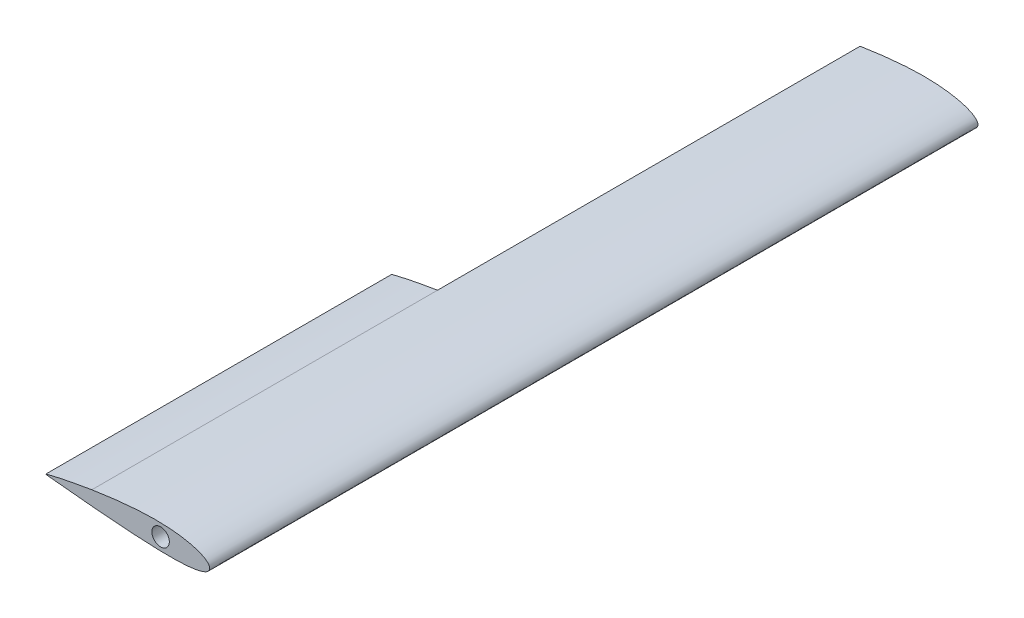
ISO-10303-21;
HEADER;
FILE_DESCRIPTION(('STEP AP214'),'2;1');
FILE_NAME('part.step','',(''),(''),'','','');
FILE_SCHEMA(('AUTOMOTIVE_DESIGN { 1 0 10303 214 1 1 1 1 }'));
ENDSEC;
DATA;
#1=APPLICATION_CONTEXT('core data for automotive mechanical design processes');
#2=APPLICATION_PROTOCOL_DEFINITION('international standard','automotive_design',2000,#1);
#3=PRODUCT_CONTEXT('',#1,'mechanical');
#4=PRODUCT('Part','Part','',(#3));
#5=PRODUCT_RELATED_PRODUCT_CATEGORY('part','',(#4));
#6=PRODUCT_DEFINITION_FORMATION('','',#4);
#7=PRODUCT_DEFINITION_CONTEXT('part definition',#1,'design');
#8=PRODUCT_DEFINITION('design','',#6,#7);
#9=PRODUCT_DEFINITION_SHAPE('','',#8);
#10=(LENGTH_UNIT() NAMED_UNIT(*) SI_UNIT(.MILLI.,.METRE.));
#11=(NAMED_UNIT(*) PLANE_ANGLE_UNIT() SI_UNIT($,.RADIAN.));
#12=(NAMED_UNIT(*) SI_UNIT($,.STERADIAN.) SOLID_ANGLE_UNIT());
#13=UNCERTAINTY_MEASURE_WITH_UNIT(LENGTH_MEASURE(1.E-05),#10,'distance_accuracy_value','');
#14=(GEOMETRIC_REPRESENTATION_CONTEXT(3) GLOBAL_UNCERTAINTY_ASSIGNED_CONTEXT((#13)) GLOBAL_UNIT_ASSIGNED_CONTEXT((#10,
#11,#12)) REPRESENTATION_CONTEXT('',''));
#15=CARTESIAN_POINT('',(0.,0.,0.));
#16=DIRECTION('',(0.,0.,1.));
#17=DIRECTION('',(1.,0.,0.));
#18=AXIS2_PLACEMENT_3D('',#15,#16,#17);
#19=CARTESIAN_POINT('',(-171.846,-6.8859458174672,-1120.));
#20=CARTESIAN_POINT('',(-169.445500495057,-7.10059578031412,-1120.));
#21=CARTESIAN_POINT('',(-164.120854312164,-7.57671964660847,-1120.));
#22=CARTESIAN_POINT('',(-155.798515887061,-8.29774530729197,-1120.));
#23=CARTESIAN_POINT('',(-146.82606609712,-9.05269906799401,-1120.));
#24=CARTESIAN_POINT('',(-137.692554641866,-9.79026887636794,-1120.));
#25=CARTESIAN_POINT('',(-128.453974412743,-10.4981972349087,-1120.));
#26=CARTESIAN_POINT('',(-119.166555289154,-11.1621144962876,-1120.));
#27=CARTESIAN_POINT('',(-109.88649318211,-11.7661976574275,-1120.));
#28=CARTESIAN_POINT('',(-100.683075099608,-12.2946554630794,-1120.));
#29=CARTESIAN_POINT('',(-91.6285836977069,-12.7253438577782,-1120.));
#30=CARTESIAN_POINT('',(-82.7786921862933,-13.0968894741235,-1120.));
#31=CARTESIAN_POINT('',(-74.1699867938844,-13.3842580555591,-1120.));
#32=CARTESIAN_POINT('',(-65.8334260635804,-13.5712530139767,-1120.));
#33=CARTESIAN_POINT('',(-57.8154332591305,-13.6399608708484,-1120.));
#34=CARTESIAN_POINT('',(-50.160721884091,-13.5749224951301,-1120.));
#35=CARTESIAN_POINT('',(-42.9121901914159,-13.3629694310149,-1120.));
#36=CARTESIAN_POINT('',(-36.1108446538748,-12.9938007179074,-1120.));
#37=CARTESIAN_POINT('',(-29.7956590255382,-12.4601537182947,-1120.));
#38=CARTESIAN_POINT('',(-24.0033555478795,-11.7578375462022,-1120.));
#39=CARTESIAN_POINT('',(-18.7680656078937,-10.8855390450986,-1120.));
#40=CARTESIAN_POINT('',(-14.1208062248208,-9.84441937275084,-1120.));
#41=CARTESIAN_POINT('',(-10.0886886233779,-8.63729436639388,-1120.));
#42=CARTESIAN_POINT('',(-6.69372832298311,-7.26730024454799,-1120.));
#43=CARTESIAN_POINT('',(-3.95171243941144,-5.73405902049488,-1120.));
#44=CARTESIAN_POINT('',(-1.87387651663263,-4.02782014238744,-1120.));
#45=CARTESIAN_POINT('',(-0.485118951259673,-2.11664836578969,-1120.));
#46=CARTESIAN_POINT('',(0.129841681260914,-0.0130409179100886,-1120.));
#47=CARTESIAN_POINT('',(-0.0566600176232738,2.17249369177211,-1120.));
#48=CARTESIAN_POINT('',(-1.05224478430025,4.32261053654658,-1120.));
#49=CARTESIAN_POINT('',(-2.78315758748847,6.40154054100684,-1120.));
#50=CARTESIAN_POINT('',(-5.22523940459049,8.42890404838555,-1120.));
#51=CARTESIAN_POINT('',(-8.3724883945445,10.4021399743308,-1120.));
#52=CARTESIAN_POINT('',(-12.2151870573469,12.3056413318673,-1120.));
#53=CARTESIAN_POINT('',(-16.7366506098346,14.1166483874969,-1120.));
#54=CARTESIAN_POINT('',(-21.913282388799,15.8098332439343,-1120.));
#55=CARTESIAN_POINT('',(-27.7153397349146,17.359414779143,-1120.));
#56=CARTESIAN_POINT('',(-34.1074981398127,18.7407339465614,-1120.));
#57=CARTESIAN_POINT('',(-41.0493501705292,19.9313959586649,-1120.));
#58=CARTESIAN_POINT('',(-48.4958757217512,20.9121858558274,-1120.));
#59=CARTESIAN_POINT('',(-56.397940476582,21.6677691129187,-1120.));
#60=CARTESIAN_POINT('',(-64.7028285837109,22.1871146204139,-1120.));
#61=CARTESIAN_POINT('',(-73.3548325723631,22.4639290080596,-1120.));
#62=CARTESIAN_POINT('',(-82.2957901982589,22.4959698610246,-1120.));
#63=CARTESIAN_POINT('',(-91.448634266557,22.2881550631337,-1120.));
#64=CARTESIAN_POINT('',(-100.738687872728,21.8426120642163,-1120.));
#65=CARTESIAN_POINT('',(-110.108636731325,21.2290146035072,-1120.));
#66=CARTESIAN_POINT('',(-119.5167801635,20.4575897190678,-1120.));
#67=CARTESIAN_POINT('',(-128.917260910405,19.5454918191666,-1120.));
#68=CARTESIAN_POINT('',(-138.251119140644,18.509863587233,-1120.));
#69=CARTESIAN_POINT('',(-147.460336342519,17.3704046575815,-1120.));
#70=CARTESIAN_POINT('',(-156.487198096307,16.1422536028045,-1120.));
#71=CARTESIAN_POINT('',(-164.597904490877,14.9579757724246,-1120.));
#72=CARTESIAN_POINT('',(-169.687195915418,14.1466082189336,-1120.));
#73=CARTESIAN_POINT('',(-171.846,13.8024377947117,-1120.));
#74=B_SPLINE_CURVE_WITH_KNOTS('',3,(#19,#20,#21,#22,#23,#24,#25,#26,#27,#28,#29,#30,#31,#32,#33,
#34,#35,#36,#37,#38,#39,#40,#41,#42,#43,#44,#45,#46,#47,#48,#49,#50,#51,#52,#53,#54,#55,#56,#57,
#58,#59,#60,#61,#62,#63,#64,#65,#66,#67,#68,#69,#70,#71,#72,#73),.UNSPECIFIED.,.F.,.F.,(4,1,1,1,
1,1,1,1,1,1,1,1,1,1,1,1,1,1,1,1,1,1,1,1,1,1,1,1,1,1,1,1,1,1,1,1,1,1,1,1,1,1,1,1,1,1,1,1,1,1,1,1,
4),(0.,0.0203123247552929,0.0450555987415345,0.07040400679398,0.0961999993885911,
0.122283996098882,0.148495529313847,0.174674438627084,0.200662098763371,0.226189300320418,
0.25107194208632,0.275314951793577,0.298783413997224,0.32134908790219,0.342891080287374,
0.363296498202736,0.382461175238921,0.400290624344227,0.416701457523534,0.431623657629183,
0.445004355911333,0.456814304998181,0.467059338849233,0.475801288432401,0.483196174748674,
0.489556652303001,0.495413049192666,0.501269836081898,0.507639846140704,0.515071645162168,
0.523896327535916,0.534285274767151,0.546312363460599,0.559992259559535,0.575301318671111,
0.592188988742453,0.610584276613813,0.630399623150398,0.651533398098745,0.673871667406779,
0.69728960133289,0.721652736083369,0.746818208479496,0.772636022521288,0.798804553306532,
0.825199510485812,0.851772556299735,0.878359882689069,0.904796908123809,0.930919587753985,
0.956565654369665,0.981575776481233,1.),.UNSPECIFIED.);
#75=DIRECTION('',(0.,0.,1.));
#76=VECTOR('',#75,1.);
#77=SURFACE_OF_LINEAR_EXTRUSION('',#74,#76);
#78=CARTESIAN_POINT('',(-171.846,-6.8859458174672,0.));
#79=CARTESIAN_POINT('',(-169.445500495057,-7.10059578031412,0.));
#80=CARTESIAN_POINT('',(-164.120854312164,-7.57671964660847,0.));
#81=CARTESIAN_POINT('',(-155.798515887061,-8.29774530729197,0.));
#82=CARTESIAN_POINT('',(-146.82606609712,-9.05269906799401,0.));
#83=CARTESIAN_POINT('',(-137.692554641866,-9.79026887636794,0.));
#84=CARTESIAN_POINT('',(-128.453974412743,-10.4981972349087,0.));
#85=CARTESIAN_POINT('',(-119.166555289154,-11.1621144962876,0.));
#86=CARTESIAN_POINT('',(-109.88649318211,-11.7661976574275,0.));
#87=CARTESIAN_POINT('',(-100.683075099608,-12.2946554630794,0.));
#88=CARTESIAN_POINT('',(-91.6285836977069,-12.7253438577782,0.));
#89=CARTESIAN_POINT('',(-82.7786921862933,-13.0968894741235,0.));
#90=CARTESIAN_POINT('',(-74.1699867938844,-13.3842580555591,0.));
#91=CARTESIAN_POINT('',(-65.8334260635804,-13.5712530139767,0.));
#92=CARTESIAN_POINT('',(-57.8154332591305,-13.6399608708484,0.));
#93=CARTESIAN_POINT('',(-50.160721884091,-13.5749224951301,0.));
#94=CARTESIAN_POINT('',(-42.9121901914159,-13.3629694310149,0.));
#95=CARTESIAN_POINT('',(-36.1108446538748,-12.9938007179074,0.));
#96=CARTESIAN_POINT('',(-29.7956590255382,-12.4601537182947,0.));
#97=CARTESIAN_POINT('',(-24.0033555478795,-11.7578375462022,0.));
#98=CARTESIAN_POINT('',(-18.7680656078937,-10.8855390450986,0.));
#99=CARTESIAN_POINT('',(-14.1208062248208,-9.84441937275084,0.));
#100=CARTESIAN_POINT('',(-10.0886886233779,-8.63729436639388,0.));
#101=CARTESIAN_POINT('',(-6.69372832298311,-7.26730024454799,0.));
#102=CARTESIAN_POINT('',(-3.95171243941144,-5.73405902049488,0.));
#103=CARTESIAN_POINT('',(-1.87387651663263,-4.02782014238744,0.));
#104=CARTESIAN_POINT('',(-0.485118951259673,-2.11664836578969,0.));
#105=CARTESIAN_POINT('',(0.129841681260914,-0.0130409179100886,0.));
#106=CARTESIAN_POINT('',(-0.0566600176232738,2.17249369177211,0.));
#107=CARTESIAN_POINT('',(-1.05224478430025,4.32261053654658,0.));
#108=CARTESIAN_POINT('',(-2.78315758748847,6.40154054100684,0.));
#109=CARTESIAN_POINT('',(-5.22523940459049,8.42890404838555,0.));
#110=CARTESIAN_POINT('',(-8.3724883945445,10.4021399743308,0.));
#111=CARTESIAN_POINT('',(-12.2151870573469,12.3056413318673,0.));
#112=CARTESIAN_POINT('',(-16.7366506098346,14.1166483874969,0.));
#113=CARTESIAN_POINT('',(-21.913282388799,15.8098332439343,0.));
#114=CARTESIAN_POINT('',(-27.7153397349146,17.359414779143,0.));
#115=CARTESIAN_POINT('',(-34.1074981398127,18.7407339465614,0.));
#116=CARTESIAN_POINT('',(-41.0493501705292,19.9313959586649,0.));
#117=CARTESIAN_POINT('',(-48.4958757217512,20.9121858558274,0.));
#118=CARTESIAN_POINT('',(-56.397940476582,21.6677691129187,0.));
#119=CARTESIAN_POINT('',(-64.7028285837109,22.1871146204139,0.));
#120=CARTESIAN_POINT('',(-73.3548325723631,22.4639290080596,0.));
#121=CARTESIAN_POINT('',(-82.2957901982589,22.4959698610246,0.));
#122=CARTESIAN_POINT('',(-91.448634266557,22.2881550631337,0.));
#123=CARTESIAN_POINT('',(-100.738687872728,21.8426120642163,0.));
#124=CARTESIAN_POINT('',(-110.108636731325,21.2290146035072,0.));
#125=CARTESIAN_POINT('',(-119.5167801635,20.4575897190678,0.));
#126=CARTESIAN_POINT('',(-128.917260910405,19.5454918191666,0.));
#127=CARTESIAN_POINT('',(-138.251119140644,18.509863587233,0.));
#128=CARTESIAN_POINT('',(-147.460336342519,17.3704046575815,0.));
#129=CARTESIAN_POINT('',(-156.487198096307,16.1422536028045,0.));
#130=CARTESIAN_POINT('',(-164.597904490877,14.9579757724246,0.));
#131=CARTESIAN_POINT('',(-169.687195915418,14.1466082189336,0.));
#132=CARTESIAN_POINT('',(-171.846,13.8024377947117,0.));
#133=B_SPLINE_CURVE_WITH_KNOTS('',3,(#78,#79,#80,#81,#82,#83,#84,#85,#86,#87,#88,#89,#90,#91,
#92,#93,#94,#95,#96,#97,#98,#99,#100,#101,#102,#103,#104,#105,#106,#107,#108,#109,#110,#111,
#112,#113,#114,#115,#116,#117,#118,#119,#120,#121,#122,#123,#124,#125,#126,#127,#128,#129,#130,
#131,#132),.UNSPECIFIED.,.F.,.F.,(4,1,1,1,1,1,1,1,1,1,1,1,1,1,1,1,1,1,1,1,1,1,1,1,1,1,1,1,1,1,1,
1,1,1,1,1,1,1,1,1,1,1,1,1,1,1,1,1,1,1,1,1,4),(0.,0.0203123247552929,0.0450555987415345,
0.07040400679398,0.0961999993885911,0.122283996098882,0.148495529313847,0.174674438627084,
0.200662098763371,0.226189300320418,0.25107194208632,0.275314951793577,0.298783413997224,
0.32134908790219,0.342891080287374,0.363296498202736,0.382461175238921,0.400290624344227,
0.416701457523534,0.431623657629183,0.445004355911333,0.456814304998181,0.467059338849233,
0.475801288432401,0.483196174748674,0.489556652303001,0.495413049192666,0.501269836081898,
0.507639846140704,0.515071645162168,0.523896327535916,0.534285274767151,0.546312363460599,
0.559992259559535,0.575301318671111,0.592188988742453,0.610584276613813,0.630399623150398,
0.651533398098745,0.673871667406779,0.69728960133289,0.721652736083369,0.746818208479496,
0.772636022521288,0.798804553306532,0.825199510485812,0.851772556299735,0.878359882689069,
0.904796908123809,0.930919587753985,0.956565654369665,0.981575776481233,1.),.UNSPECIFIED.);
#134=CARTESIAN_POINT('',(-171.846,-6.8859458174672,0.));
#135=VERTEX_POINT('',#134);
#136=CARTESIAN_POINT('',(-171.846,13.8024377947117,0.));
#137=VERTEX_POINT('',#136);
#138=EDGE_CURVE('E160',#135,#137,#133,.T.);
#139=ORIENTED_EDGE('',*,*,#138,.F.);
#140=DIRECTION('',(0.,0.,1.));
#141=VECTOR('',#140,1.);
#142=CARTESIAN_POINT('',(-171.846,-6.8859458174672,-504.));
#143=LINE('',#142,#141);
#144=CARTESIAN_POINT('',(-171.846,-6.8859458174672,-504.));
#145=VERTEX_POINT('',#144);
#146=EDGE_CURVE('E173',#145,#135,#143,.T.);
#147=ORIENTED_EDGE('',*,*,#146,.F.);
#148=DIRECTION('',(0.,0.,1.));
#149=VECTOR('',#148,1.);
#150=CARTESIAN_POINT('',(-171.846,-6.8859458174672,-1120.));
#151=LINE('',#150,#149);
#152=CARTESIAN_POINT('',(-171.846,-6.8859458174672,-1120.));
#153=VERTEX_POINT('',#152);
#154=EDGE_CURVE('E11',#153,#145,#151,.T.);
#155=ORIENTED_EDGE('',*,*,#154,.F.);
#156=CARTESIAN_POINT('',(-171.846,13.8024377947117,-1120.));
#157=VERTEX_POINT('',#156);
#158=EDGE_CURVE('E150',#153,#157,#74,.T.);
#159=ORIENTED_EDGE('',*,*,#158,.T.);
#160=DIRECTION('',(0.,0.,1.));
#161=VECTOR('',#160,1.);
#162=CARTESIAN_POINT('',(-171.846,13.8024377947117,-1120.));
#163=LINE('',#162,#161);
#164=CARTESIAN_POINT('',(-171.846,13.8024377947117,-504.));
#165=VERTEX_POINT('',#164);
#166=EDGE_CURVE('E50',#157,#165,#163,.T.);
#167=ORIENTED_EDGE('',*,*,#166,.T.);
#168=DIRECTION('',(0.,0.,1.));
#169=VECTOR('',#168,1.);
#170=CARTESIAN_POINT('',(-171.846,13.8024377947117,-504.));
#171=LINE('',#170,#169);
#172=EDGE_CURVE('E106',#165,#137,#171,.T.);
#173=ORIENTED_EDGE('',*,*,#172,.T.);
#174=EDGE_LOOP('',(#139,#147,#155,#159,#167,#173));
#175=FACE_BOUND('',#174,.T.);
#176=ADVANCED_FACE('F39',(#175),#77,.T.);
#177=CARTESIAN_POINT('',(-171.846,13.8024377947117,-1120.));
#178=DIRECTION('',(-1.,0.,0.));
#179=DIRECTION('',(0.,0.,1.));
#180=AXIS2_PLACEMENT_3D('',#177,#178,#179);
#181=PLANE('',#180);
#182=DIRECTION('',(0.,1.,0.));
#183=VECTOR('',#182,1.);
#184=CARTESIAN_POINT('',(-171.846,13.8024377947117,-504.));
#185=LINE('',#184,#183);
#186=EDGE_CURVE('E94',#145,#165,#185,.T.);
#187=ORIENTED_EDGE('',*,*,#186,.T.);
#188=ORIENTED_EDGE('',*,*,#166,.F.);
#189=DIRECTION('',(0.,-1.,0.));
#190=VECTOR('',#189,1.);
#191=CARTESIAN_POINT('',(-171.846,13.8024377947117,-1120.));
#192=LINE('',#191,#190);
#193=EDGE_CURVE('E152',#157,#153,#192,.T.);
#194=ORIENTED_EDGE('',*,*,#193,.T.);
#195=ORIENTED_EDGE('',*,*,#154,.T.);
#196=EDGE_LOOP('',(#187,#188,#194,#195));
#197=FACE_BOUND('',#196,.T.);
#198=ADVANCED_FACE('F137',(#197),#181,.T.);
#199=CARTESIAN_POINT('',(-0.0677546416395283,1.63470036410096,-1120.));
#200=DIRECTION('',(0.,0.,1.));
#201=DIRECTION('',(1.,0.,0.));
#202=AXIS2_PLACEMENT_3D('',#199,#200,#201);
#203=PLANE('',#202);
#204=ORIENTED_EDGE('',*,*,#158,.F.);
#205=ORIENTED_EDGE('',*,*,#193,.F.);
#206=EDGE_LOOP('',(#204,#205));
#207=FACE_BOUND('',#206,.T.);
#208=ADVANCED_FACE('F134',(#207),#203,.F.);
#209=CARTESIAN_POINT('',(-0.0677546416395283,1.63470036410096,0.));
#210=DIRECTION('',(0.,0.,1.));
#211=DIRECTION('',(1.,0.,0.));
#212=AXIS2_PLACEMENT_3D('',#209,#210,#211);
#213=PLANE('',#212);
#214=CARTESIAN_POINT('',(-71.603,4.475,0.));
#215=DIRECTION('',(0.,0.,1.));
#216=DIRECTION('',(1.,0.,0.));
#217=AXIS2_PLACEMENT_3D('',#214,#215,#216);
#218=CIRCLE('',#217,12.7);
#219=CARTESIAN_POINT('',(-58.903,4.475,0.));
#220=VERTEX_POINT('',#219);
#221=EDGE_CURVE('E121',#220,#220,#218,.T.);
#222=ORIENTED_EDGE('',*,*,#221,.F.);
#223=EDGE_LOOP('',(#222));
#224=FACE_BOUND('',#223,.T.);
#225=ORIENTED_EDGE('',*,*,#138,.T.);
#226=CARTESIAN_POINT('',(-171.846,13.8024377947117,0.));
#227=CARTESIAN_POINT('',(-172.525257615899,13.6960399387976,0.));
#228=CARTESIAN_POINT('',(-175.933119287711,13.1622377897369,0.));
#229=CARTESIAN_POINT('',(-181.929700077119,12.1426164719057,0.));
#230=CARTESIAN_POINT('',(-189.692578636648,10.7734354892909,0.));
#231=CARTESIAN_POINT('',(-197.014829139419,9.41006841851697,0.));
#232=CARTESIAN_POINT('',(-203.853725709074,8.0798033568466,0.));
#233=CARTESIAN_POINT('',(-210.168184203451,6.80031436592091,0.));
#234=CARTESIAN_POINT('',(-215.920853201955,5.59132147456606,0.));
#235=CARTESIAN_POINT('',(-221.077844696289,4.47147569302521,0.));
#236=CARTESIAN_POINT('',(-225.608999658332,3.4587361930405,0.));
#237=CARTESIAN_POINT('',(-229.487989981543,2.56984478339046,0.));
#238=CARTESIAN_POINT('',(-232.692417395198,1.81993812435626,0.));
#239=CARTESIAN_POINT('',(-235.203893788306,1.22216361687672,0.));
#240=CARTESIAN_POINT('',(-237.008061316949,0.787162185422781,0.));
#241=CARTESIAN_POINT('',(-238.0863502301,0.525005253345914,0.));
#242=CARTESIAN_POINT('',(-238.562115976969,0.408767052230152,0.));
#243=CARTESIAN_POINT('',(-238.675,0.381187437980616,0.));
#244=B_SPLINE_CURVE_WITH_KNOTS('',3,(#226,#227,#228,#229,#230,#231,#232,#233,#234,#235,#236,
#237,#238,#239,#240,#241,#242,#243),.UNSPECIFIED.,.F.,.F.,(4,1,1,1,1,1,1,1,1,1,1,1,1,1,1,4),(0.,
0.0302516964137182,0.151773928333774,0.267626295793447,0.377089871946651,0.479484952377692,
0.574174896828823,0.66056978866967,0.738129948553166,0.806369317748633,0.864858701366983,
0.913228834399553,0.951173207526198,0.978450569044396,0.99488700799438,1.),.UNSPECIFIED.);
#245=CARTESIAN_POINT('',(-238.675,0.381187437980616,0.));
#246=VERTEX_POINT('',#245);
#247=EDGE_CURVE('E181',#137,#246,#244,.T.);
#248=ORIENTED_EDGE('',*,*,#247,.T.);
#249=DIRECTION('',(0.,-1.,0.));
#250=VECTOR('',#249,1.);
#251=CARTESIAN_POINT('',(-238.675,0.381187437980616,0.));
#252=LINE('',#251,#250);
#253=CARTESIAN_POINT('',(-238.675,-0.37508053676849,0.));
#254=VERTEX_POINT('',#253);
#255=EDGE_CURVE('E89',#246,#254,#252,.T.);
#256=ORIENTED_EDGE('',*,*,#255,.T.);
#257=CARTESIAN_POINT('',(-238.675,-0.37508053676849,0.));
#258=CARTESIAN_POINT('',(-238.666663292953,-0.375050863072439,0.));
#259=CARTESIAN_POINT('',(-238.533564190899,-0.374577109793498,0.));
#260=CARTESIAN_POINT('',(-238.031628616167,-0.459131062708328,0.));
#261=CARTESIAN_POINT('',(-236.918777596451,-0.548714441419959,0.));
#262=CARTESIAN_POINT('',(-235.07567854556,-0.76095517665603,0.));
#263=CARTESIAN_POINT('',(-232.510834876654,-1.02388031131799,0.));
#264=CARTESIAN_POINT('',(-229.242958681744,-1.36749410541668,0.));
#265=CARTESIAN_POINT('',(-225.292785955499,-1.7736519231674,0.));
#266=CARTESIAN_POINT('',(-220.686424670281,-2.24255788349655,0.));
#267=CARTESIAN_POINT('',(-215.453758720331,-2.7672279918527,0.));
#268=CARTESIAN_POINT('',(-209.628691569676,-3.342827920806,0.));
#269=CARTESIAN_POINT('',(-203.248715471556,-3.96366231480069,0.));
#270=CARTESIAN_POINT('',(-196.354667502872,-4.62402766137786,0.));
#271=CARTESIAN_POINT('',(-188.990475626814,-5.31849067483548,0.));
#272=CARTESIAN_POINT('',(-181.202604479842,-6.03903710688791,0.));
#273=CARTESIAN_POINT('',(-175.440788036436,-6.56644350674372,0.));
#274=CARTESIAN_POINT('',(-172.279902363353,-6.84738087112971,0.));
#275=CARTESIAN_POINT('',(-171.846,-6.8859458174672,0.));
#276=B_SPLINE_CURVE_WITH_KNOTS('',3,(#257,#258,#259,#260,#261,#262,#263,#264,#265,#266,#267,
#268,#269,#270,#271,#272,#273,#274,#275),.UNSPECIFIED.,.F.,.F.,(4,1,1,1,1,1,1,1,1,1,1,1,1,1,1,1,
4),(0.,0.000372401287236923,0.0059455462038901,0.0226274177242124,0.0503057556994635,
0.0887948670404106,0.137837653804779,0.197108299470865,0.266215486559006,0.344706014421455,
0.432068697313733,0.527738446472152,0.631100471081385,0.741494566579771,0.858219490153691,
0.980537449100535,1.),.UNSPECIFIED.);
#277=EDGE_CURVE('E107',#254,#135,#276,.T.);
#278=ORIENTED_EDGE('',*,*,#277,.T.);
#279=EDGE_LOOP('',(#225,#248,#256,#278));
#280=FACE_BOUND('',#279,.T.);
#281=ADVANCED_FACE('F132',(#224,#280),#213,.T.);
#282=CARTESIAN_POINT('',(-171.846,13.8024377947117,-504.));
#283=CARTESIAN_POINT('',(-172.525257615899,13.6960399387976,-504.));
#284=CARTESIAN_POINT('',(-175.933119287711,13.1622377897369,-504.));
#285=CARTESIAN_POINT('',(-181.929700077119,12.1426164719057,-504.));
#286=CARTESIAN_POINT('',(-189.692578636648,10.7734354892909,-504.));
#287=CARTESIAN_POINT('',(-197.014829139419,9.41006841851697,-504.));
#288=CARTESIAN_POINT('',(-203.853725709074,8.0798033568466,-504.));
#289=CARTESIAN_POINT('',(-210.168184203451,6.80031436592091,-504.));
#290=CARTESIAN_POINT('',(-215.920853201955,5.59132147456606,-504.));
#291=CARTESIAN_POINT('',(-221.077844696289,4.47147569302521,-504.));
#292=CARTESIAN_POINT('',(-225.608999658332,3.4587361930405,-504.));
#293=CARTESIAN_POINT('',(-229.487989981543,2.56984478339046,-504.));
#294=CARTESIAN_POINT('',(-232.692417395198,1.81993812435626,-504.));
#295=CARTESIAN_POINT('',(-235.203893788306,1.22216361687672,-504.));
#296=CARTESIAN_POINT('',(-237.008061316949,0.787162185422781,-504.));
#297=CARTESIAN_POINT('',(-238.0863502301,0.525005253345914,-504.));
#298=CARTESIAN_POINT('',(-238.562115976969,0.408767052230152,-504.));
#299=CARTESIAN_POINT('',(-238.675,0.381187437980616,-504.));
#300=B_SPLINE_CURVE_WITH_KNOTS('',3,(#282,#283,#284,#285,#286,#287,#288,#289,#290,#291,#292,
#293,#294,#295,#296,#297,#298,#299),.UNSPECIFIED.,.F.,.F.,(4,1,1,1,1,1,1,1,1,1,1,1,1,1,1,4),(0.,
0.0302516964137182,0.151773928333774,0.267626295793447,0.377089871946651,0.479484952377692,
0.574174896828823,0.66056978866967,0.738129948553166,0.806369317748633,0.864858701366983,
0.913228834399553,0.951173207526198,0.978450569044396,0.99488700799438,1.),.UNSPECIFIED.);
#301=DIRECTION('',(0.,0.,1.));
#302=VECTOR('',#301,1.);
#303=SURFACE_OF_LINEAR_EXTRUSION('',#300,#302);
#304=ORIENTED_EDGE('',*,*,#247,.F.);
#305=ORIENTED_EDGE('',*,*,#172,.F.);
#306=CARTESIAN_POINT('',(-238.675,0.381187437980616,-504.));
#307=VERTEX_POINT('',#306);
#308=EDGE_CURVE('E101',#165,#307,#300,.T.);
#309=ORIENTED_EDGE('',*,*,#308,.T.);
#310=DIRECTION('',(0.,0.,1.));
#311=VECTOR('',#310,1.);
#312=CARTESIAN_POINT('',(-238.675,0.381187437980616,-504.));
#313=LINE('',#312,#311);
#314=EDGE_CURVE('E84',#307,#246,#313,.T.);
#315=ORIENTED_EDGE('',*,*,#314,.T.);
#316=EDGE_LOOP('',(#304,#305,#309,#315));
#317=FACE_BOUND('',#316,.T.);
#318=ADVANCED_FACE('F104',(#317),#303,.T.);
#319=CARTESIAN_POINT('',(-238.675,-0.37508053676849,-504.));
#320=CARTESIAN_POINT('',(-238.666663292953,-0.375050863072439,-504.));
#321=CARTESIAN_POINT('',(-238.533564190899,-0.374577109793498,-504.));
#322=CARTESIAN_POINT('',(-238.031628616167,-0.459131062708328,-504.));
#323=CARTESIAN_POINT('',(-236.918777596451,-0.548714441419959,-504.));
#324=CARTESIAN_POINT('',(-235.07567854556,-0.76095517665603,-504.));
#325=CARTESIAN_POINT('',(-232.510834876654,-1.02388031131799,-504.));
#326=CARTESIAN_POINT('',(-229.242958681744,-1.36749410541668,-504.));
#327=CARTESIAN_POINT('',(-225.292785955499,-1.7736519231674,-504.));
#328=CARTESIAN_POINT('',(-220.686424670281,-2.24255788349655,-504.));
#329=CARTESIAN_POINT('',(-215.453758720331,-2.7672279918527,-504.));
#330=CARTESIAN_POINT('',(-209.628691569676,-3.342827920806,-504.));
#331=CARTESIAN_POINT('',(-203.248715471556,-3.96366231480069,-504.));
#332=CARTESIAN_POINT('',(-196.354667502872,-4.62402766137786,-504.));
#333=CARTESIAN_POINT('',(-188.990475626814,-5.31849067483548,-504.));
#334=CARTESIAN_POINT('',(-181.202604479842,-6.03903710688791,-504.));
#335=CARTESIAN_POINT('',(-175.440788036436,-6.56644350674372,-504.));
#336=CARTESIAN_POINT('',(-172.279902363353,-6.84738087112971,-504.));
#337=CARTESIAN_POINT('',(-171.846,-6.8859458174672,-504.));
#338=B_SPLINE_CURVE_WITH_KNOTS('',3,(#319,#320,#321,#322,#323,#324,#325,#326,#327,#328,#329,
#330,#331,#332,#333,#334,#335,#336,#337),.UNSPECIFIED.,.F.,.F.,(4,1,1,1,1,1,1,1,1,1,1,1,1,1,1,1,
4),(0.,0.000372401287236923,0.0059455462038901,0.0226274177242124,0.0503057556994635,
0.0887948670404106,0.137837653804779,0.197108299470865,0.266215486559006,0.344706014421455,
0.432068697313733,0.527738446472152,0.631100471081385,0.741494566579771,0.858219490153691,
0.980537449100535,1.),.UNSPECIFIED.);
#339=DIRECTION('',(0.,0.,1.));
#340=VECTOR('',#339,1.);
#341=SURFACE_OF_LINEAR_EXTRUSION('',#338,#340);
#342=ORIENTED_EDGE('',*,*,#277,.F.);
#343=DIRECTION('',(0.,0.,1.));
#344=VECTOR('',#343,1.);
#345=CARTESIAN_POINT('',(-238.675,-0.37508053676849,-504.));
#346=LINE('',#345,#344);
#347=CARTESIAN_POINT('',(-238.675,-0.37508053676849,-504.));
#348=VERTEX_POINT('',#347);
#349=EDGE_CURVE('E93',#348,#254,#346,.T.);
#350=ORIENTED_EDGE('',*,*,#349,.F.);
#351=EDGE_CURVE('E43',#348,#145,#338,.T.);
#352=ORIENTED_EDGE('',*,*,#351,.T.);
#353=ORIENTED_EDGE('',*,*,#146,.T.);
#354=EDGE_LOOP('',(#342,#350,#352,#353));
#355=FACE_BOUND('',#354,.T.);
#356=ADVANCED_FACE('F131',(#355),#341,.T.);
#357=CARTESIAN_POINT('',(-238.675,0.381187437980616,-504.));
#358=DIRECTION('',(-1.,0.,0.));
#359=DIRECTION('',(0.,0.,1.));
#360=AXIS2_PLACEMENT_3D('',#357,#358,#359);
#361=PLANE('',#360);
#362=ORIENTED_EDGE('',*,*,#255,.F.);
#363=ORIENTED_EDGE('',*,*,#314,.F.);
#364=DIRECTION('',(0.,-1.,0.));
#365=VECTOR('',#364,1.);
#366=CARTESIAN_POINT('',(-238.675,0.381187437980616,-504.));
#367=LINE('',#366,#365);
#368=EDGE_CURVE('E87',#307,#348,#367,.T.);
#369=ORIENTED_EDGE('',*,*,#368,.T.);
#370=ORIENTED_EDGE('',*,*,#349,.T.);
#371=EDGE_LOOP('',(#362,#363,#369,#370));
#372=FACE_BOUND('',#371,.T.);
#373=ADVANCED_FACE('F86',(#372),#361,.T.);
#374=CARTESIAN_POINT('',(-205.395489798952,7.76335522020497,-504.));
#375=DIRECTION('',(0.,0.,-1.));
#376=DIRECTION('',(-1.,0.,0.));
#377=AXIS2_PLACEMENT_3D('',#374,#375,#376);
#378=PLANE('',#377);
#379=ORIENTED_EDGE('',*,*,#308,.F.);
#380=ORIENTED_EDGE('',*,*,#186,.F.);
#381=ORIENTED_EDGE('',*,*,#351,.F.);
#382=ORIENTED_EDGE('',*,*,#368,.F.);
#383=EDGE_LOOP('',(#379,#380,#381,#382));
#384=FACE_BOUND('',#383,.T.);
#385=ADVANCED_FACE('F99',(#384),#378,.T.);
#386=CARTESIAN_POINT('',(-71.603,4.475,-800.));
#387=DIRECTION('',(0.,0.,1.));
#388=DIRECTION('',(1.,0.,0.));
#389=AXIS2_PLACEMENT_3D('',#386,#387,#388);
#390=CYLINDRICAL_SURFACE('',#389,12.7);
#391=CARTESIAN_POINT('',(-71.603,4.475,-800.));
#392=DIRECTION('',(0.,0.,1.));
#393=DIRECTION('',(1.,0.,0.));
#394=AXIS2_PLACEMENT_3D('',#391,#392,#393);
#395=CIRCLE('',#394,12.7);
#396=CARTESIAN_POINT('',(-58.903,4.475,-800.));
#397=VERTEX_POINT('',#396);
#398=EDGE_CURVE('E184',#397,#397,#395,.T.);
#399=ORIENTED_EDGE('',*,*,#398,.F.);
#400=EDGE_LOOP('',(#399));
#401=FACE_BOUND('',#400,.T.);
#402=ORIENTED_EDGE('',*,*,#221,.T.);
#403=EDGE_LOOP('',(#402));
#404=FACE_BOUND('',#403,.T.);
#405=ADVANCED_FACE('F200',(#401,#404),#390,.F.);
#406=CARTESIAN_POINT('',(-71.603,4.475,-800.));
#407=DIRECTION('',(0.,0.,1.));
#408=DIRECTION('',(1.,0.,0.));
#409=AXIS2_PLACEMENT_3D('',#406,#407,#408);
#410=PLANE('',#409);
#411=ORIENTED_EDGE('',*,*,#398,.T.);
#412=EDGE_LOOP('',(#411));
#413=FACE_BOUND('',#412,.T.);
#414=ADVANCED_FACE('F203',(#413),#410,.T.);
#415=CLOSED_SHELL('',(#176,#198,#208,#281,#318,#356,#373,#385,#405,#414));
#416=MANIFOLD_SOLID_BREP('B2',#415);
#417=ADVANCED_BREP_SHAPE_REPRESENTATION('',(#18,#416),#14);
#418=SHAPE_DEFINITION_REPRESENTATION(#9,#417);
ENDSEC;
END-ISO-10303-21;
